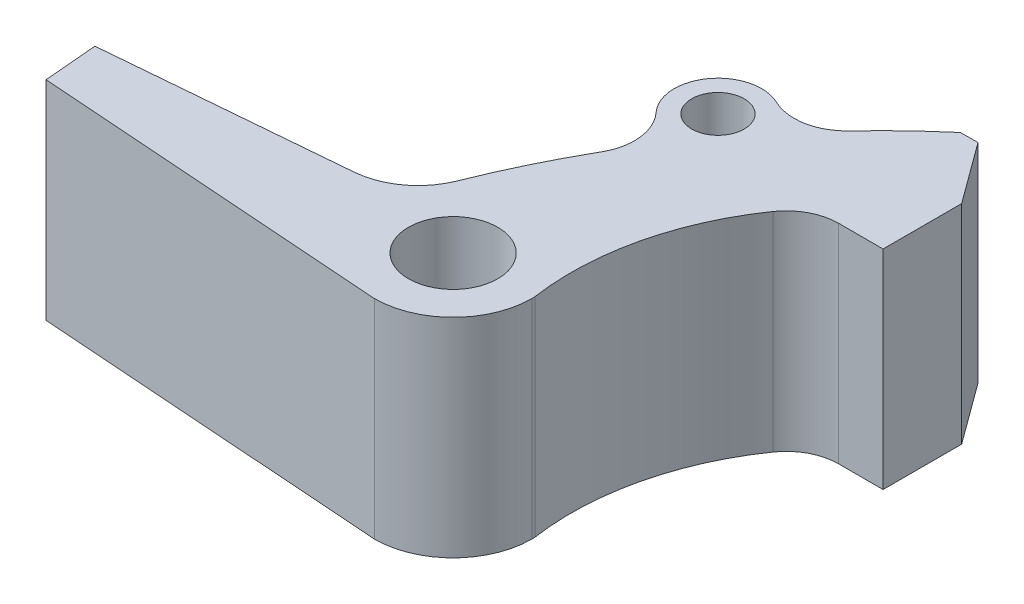
ISO-10303-21;
HEADER;
FILE_DESCRIPTION(('STEP AP214'),'2;1');
FILE_NAME('part.step','',(''),(''),'','','');
FILE_SCHEMA(('AUTOMOTIVE_DESIGN { 1 0 10303 214 1 1 1 1 }'));
ENDSEC;
DATA;
#1=APPLICATION_CONTEXT('core data for automotive mechanical design processes');
#2=APPLICATION_PROTOCOL_DEFINITION('international standard','automotive_design',2000,#1);
#3=PRODUCT_CONTEXT('',#1,'mechanical');
#4=PRODUCT('Part','Part','',(#3));
#5=PRODUCT_RELATED_PRODUCT_CATEGORY('part','',(#4));
#6=PRODUCT_DEFINITION_FORMATION('','',#4);
#7=PRODUCT_DEFINITION_CONTEXT('part definition',#1,'design');
#8=PRODUCT_DEFINITION('design','',#6,#7);
#9=PRODUCT_DEFINITION_SHAPE('','',#8);
#10=(LENGTH_UNIT() NAMED_UNIT(*) SI_UNIT(.MILLI.,.METRE.));
#11=(NAMED_UNIT(*) PLANE_ANGLE_UNIT() SI_UNIT($,.RADIAN.));
#12=(NAMED_UNIT(*) SI_UNIT($,.STERADIAN.) SOLID_ANGLE_UNIT());
#13=UNCERTAINTY_MEASURE_WITH_UNIT(LENGTH_MEASURE(1.E-05),#10,'distance_accuracy_value','');
#14=(GEOMETRIC_REPRESENTATION_CONTEXT(3) GLOBAL_UNCERTAINTY_ASSIGNED_CONTEXT((#13)) GLOBAL_UNIT_ASSIGNED_CONTEXT((#10,
#11,#12)) REPRESENTATION_CONTEXT('',''));
#15=CARTESIAN_POINT('',(0.,0.,0.));
#16=DIRECTION('',(0.,0.,1.));
#17=DIRECTION('',(1.,0.,0.));
#18=AXIS2_PLACEMENT_3D('',#15,#16,#17);
#19=CARTESIAN_POINT('',(3.09951762792645,11.9,-19.3887654268684));
#20=DIRECTION('',(0.,-1.,0.));
#21=DIRECTION('',(0.,0.,-1.));
#22=AXIS2_PLACEMENT_3D('',#19,#20,#21);
#23=CYLINDRICAL_SURFACE('',#22,3.);
#24=CARTESIAN_POINT('',(3.09951762792645,2.59,-19.3887654268684));
#25=DIRECTION('',(0.,1.,0.));
#26=DIRECTION('',(0.,0.,1.));
#27=AXIS2_PLACEMENT_3D('',#24,#25,#26);
#28=CIRCLE('',#27,3.);
#29=CARTESIAN_POINT('',(1.7947960396835,2.59,-16.6873395853594));
#30=VERTEX_POINT('',#29);
#31=CARTESIAN_POINT('',(5.27941384436174,2.59,-17.3276850098126));
#32=VERTEX_POINT('',#31);
#33=EDGE_CURVE('E63',#30,#32,#28,.T.);
#34=ORIENTED_EDGE('',*,*,#33,.T.);
#35=DIRECTION('',(0.,-1.,0.));
#36=VECTOR('',#35,1.);
#37=CARTESIAN_POINT('',(5.27941384436174,11.9,-17.3276850098126));
#38=LINE('',#37,#36);
#39=CARTESIAN_POINT('',(5.27941384436174,0.,-17.3276850098126));
#40=VERTEX_POINT('',#39);
#41=EDGE_CURVE('E296',#32,#40,#38,.T.);
#42=ORIENTED_EDGE('',*,*,#41,.T.);
#43=CARTESIAN_POINT('',(3.09951762792645,0.,-19.3887654268684));
#44=DIRECTION('',(0.,1.,0.));
#45=DIRECTION('',(0.,0.,1.));
#46=AXIS2_PLACEMENT_3D('',#43,#44,#45);
#47=CIRCLE('',#46,3.);
#48=CARTESIAN_POINT('',(1.79479603968349,0.,-16.6873395853594));
#49=VERTEX_POINT('',#48);
#50=EDGE_CURVE('E328',#49,#40,#47,.T.);
#51=ORIENTED_EDGE('',*,*,#50,.F.);
#52=DIRECTION('',(0.,-1.,0.));
#53=VECTOR('',#52,1.);
#54=CARTESIAN_POINT('',(1.79479603968349,11.9,-16.6873395853594));
#55=LINE('',#54,#53);
#56=EDGE_CURVE('E389',#30,#49,#55,.T.);
#57=ORIENTED_EDGE('',*,*,#56,.F.);
#58=EDGE_LOOP('',(#34,#42,#51,#57));
#59=FACE_BOUND('',#58,.T.);
#60=ADVANCED_FACE('F47',(#59),#23,.F.);
#61=CARTESIAN_POINT('',(-3.34631316143594,11.9,-10.7191133917387));
#62=DIRECTION('',(0.,-1.,0.));
#63=DIRECTION('',(0.,0.,-1.));
#64=AXIS2_PLACEMENT_3D('',#61,#62,#63);
#65=CYLINDRICAL_SURFACE('',#64,3.);
#66=DIRECTION('',(0.,-1.,0.));
#67=VECTOR('',#66,1.);
#68=CARTESIAN_POINT('',(-0.744733852199163,11.9,-9.22519736406142));
#69=LINE('',#68,#67);
#70=CARTESIAN_POINT('',(-0.744733852199163,2.59,-9.22519736406142));
#71=VERTEX_POINT('',#70);
#72=CARTESIAN_POINT('',(-0.744733852199163,0.,-9.22519736406142));
#73=VERTEX_POINT('',#72);
#74=EDGE_CURVE('E506',#71,#73,#69,.T.);
#75=ORIENTED_EDGE('',*,*,#74,.F.);
#76=CARTESIAN_POINT('',(-3.34631316143594,2.59,-10.7191133917387));
#77=DIRECTION('',(0.,1.,0.));
#78=DIRECTION('',(0.,0.,1.));
#79=AXIS2_PLACEMENT_3D('',#76,#77,#78);
#80=CIRCLE('',#79,3.);
#81=CARTESIAN_POINT('',(-1.13512704639032,2.59,-12.7465886603004));
#82=VERTEX_POINT('',#81);
#83=EDGE_CURVE('E315',#82,#71,#80,.F.);
#84=ORIENTED_EDGE('',*,*,#83,.F.);
#85=DIRECTION('',(0.,-1.,0.));
#86=VECTOR('',#85,1.);
#87=CARTESIAN_POINT('',(-1.13512704639032,11.9,-12.7465886603004));
#88=LINE('',#87,#86);
#89=CARTESIAN_POINT('',(-1.13512704639032,0.,-12.7465886603004));
#90=VERTEX_POINT('',#89);
#91=EDGE_CURVE('E238',#82,#90,#88,.T.);
#92=ORIENTED_EDGE('',*,*,#91,.T.);
#93=CARTESIAN_POINT('',(-3.34631316143594,0.,-10.7191133917387));
#94=DIRECTION('',(0.,1.,0.));
#95=DIRECTION('',(0.,0.,1.));
#96=AXIS2_PLACEMENT_3D('',#93,#94,#95);
#97=CIRCLE('',#96,3.);
#98=EDGE_CURVE('E401',#90,#73,#97,.F.);
#99=ORIENTED_EDGE('',*,*,#98,.T.);
#100=EDGE_LOOP('',(#75,#84,#92,#99));
#101=FACE_BOUND('',#100,.T.);
#102=ADVANCED_FACE('F548',(#101),#65,.F.);
#103=CARTESIAN_POINT('',(0.707528049481027,11.9,-14.4361513841019));
#104=DIRECTION('',(0.,-1.,0.));
#105=DIRECTION('',(0.,0.,-1.));
#106=AXIS2_PLACEMENT_3D('',#103,#104,#105);
#107=CYLINDRICAL_SURFACE('',#106,2.5);
#108=CARTESIAN_POINT('',(0.707528049481027,2.59,-14.4361513841019));
#109=DIRECTION('',(0.,1.,0.));
#110=DIRECTION('',(0.,0.,1.));
#111=AXIS2_PLACEMENT_3D('',#108,#109,#110);
#112=CIRCLE('',#111,2.5);
#113=EDGE_CURVE('E312',#30,#82,#112,.T.);
#114=ORIENTED_EDGE('',*,*,#113,.F.);
#115=ORIENTED_EDGE('',*,*,#56,.T.);
#116=CARTESIAN_POINT('',(0.707528049481027,0.,-14.4361513841019));
#117=DIRECTION('',(0.,1.,0.));
#118=DIRECTION('',(0.,0.,1.));
#119=AXIS2_PLACEMENT_3D('',#116,#117,#118);
#120=CIRCLE('',#119,2.5);
#121=EDGE_CURVE('E397',#49,#90,#120,.T.);
#122=ORIENTED_EDGE('',*,*,#121,.T.);
#123=ORIENTED_EDGE('',*,*,#91,.F.);
#124=EDGE_LOOP('',(#114,#115,#122,#123));
#125=FACE_BOUND('',#124,.T.);
#126=ADVANCED_FACE('F543',(#125),#107,.T.);
#127=CARTESIAN_POINT('',(-3.34631316143594,8.59,-10.7191133917387));
#128=DIRECTION('',(0.,1.,0.));
#129=DIRECTION('',(0.,0.,1.));
#130=AXIS2_PLACEMENT_3D('',#127,#128,#129);
#131=CIRCLE('',#130,3.);
#132=CARTESIAN_POINT('',(-1.13512704639032,8.59,-12.7465886603004));
#133=VERTEX_POINT('',#132);
#134=CARTESIAN_POINT('',(-0.744733852199163,8.59,-9.22519736406142));
#135=VERTEX_POINT('',#134);
#136=EDGE_CURVE('E71',#133,#135,#131,.F.);
#137=ORIENTED_EDGE('',*,*,#136,.T.);
#138=CARTESIAN_POINT('',(-0.744733852199163,11.9,-9.22519736406142));
#139=VERTEX_POINT('',#138);
#140=EDGE_CURVE('E243',#139,#135,#69,.T.);
#141=ORIENTED_EDGE('',*,*,#140,.F.);
#142=CARTESIAN_POINT('',(-3.34631316143594,11.9,-10.7191133917387));
#143=DIRECTION('',(0.,1.,0.));
#144=DIRECTION('',(0.,0.,1.));
#145=AXIS2_PLACEMENT_3D('',#142,#143,#144);
#146=CIRCLE('',#145,3.);
#147=CARTESIAN_POINT('',(-1.13512704639032,11.9,-12.7465886603004));
#148=VERTEX_POINT('',#147);
#149=EDGE_CURVE('E234',#148,#139,#146,.F.);
#150=ORIENTED_EDGE('',*,*,#149,.F.);
#151=EDGE_CURVE('E228',#148,#133,#88,.T.);
#152=ORIENTED_EDGE('',*,*,#151,.T.);
#153=EDGE_LOOP('',(#137,#141,#150,#152));
#154=FACE_BOUND('',#153,.T.);
#155=ADVANCED_FACE('F233',(#154),#65,.F.);
#156=CARTESIAN_POINT('',(0.707528049481027,11.9,-14.4361513841019));
#157=DIRECTION('',(0.,-1.,0.));
#158=DIRECTION('',(0.,0.,-1.));
#159=AXIS2_PLACEMENT_3D('',#156,#157,#158);
#160=CYLINDRICAL_SURFACE('',#159,1.50000000000008);
#161=CARTESIAN_POINT('',(0.707528049481027,0.,-14.4361513841019));
#162=DIRECTION('',(0.,1.,0.));
#163=DIRECTION('',(0.,0.,1.));
#164=AXIS2_PLACEMENT_3D('',#161,#162,#163);
#165=CIRCLE('',#164,1.50000000000008);
#166=CARTESIAN_POINT('',(0.707528049481027,0.,-12.9361513841018));
#167=VERTEX_POINT('',#166);
#168=EDGE_CURVE('E393',#167,#167,#165,.T.);
#169=ORIENTED_EDGE('',*,*,#168,.F.);
#170=EDGE_LOOP('',(#169));
#171=FACE_BOUND('',#170,.T.);
#172=CARTESIAN_POINT('',(0.707528049481027,2.59,-14.4361513841019));
#173=DIRECTION('',(0.,1.,0.));
#174=DIRECTION('',(0.,0.,1.));
#175=AXIS2_PLACEMENT_3D('',#172,#173,#174);
#176=CIRCLE('',#175,1.50000000000008);
#177=CARTESIAN_POINT('',(0.707528049481027,2.59,-12.9361513841018));
#178=VERTEX_POINT('',#177);
#179=EDGE_CURVE('E318',#178,#178,#176,.T.);
#180=ORIENTED_EDGE('',*,*,#179,.T.);
#181=EDGE_LOOP('',(#180));
#182=FACE_BOUND('',#181,.T.);
#183=ADVANCED_FACE('F611',(#171,#182),#160,.F.);
#184=CARTESIAN_POINT('',(5.27941384436174,11.9,-17.3276850098126));
#185=VERTEX_POINT('',#184);
#186=CARTESIAN_POINT('',(5.27941384436174,8.59,-17.3276850098126));
#187=VERTEX_POINT('',#186);
#188=EDGE_CURVE('E460',#185,#187,#38,.T.);
#189=ORIENTED_EDGE('',*,*,#188,.T.);
#190=CARTESIAN_POINT('',(3.09951762792645,8.59,-19.3887654268684));
#191=DIRECTION('',(0.,1.,0.));
#192=DIRECTION('',(0.,0.,1.));
#193=AXIS2_PLACEMENT_3D('',#190,#191,#192);
#194=CIRCLE('',#193,3.);
#195=CARTESIAN_POINT('',(1.79479603968349,8.59,-16.6873395853594));
#196=VERTEX_POINT('',#195);
#197=EDGE_CURVE('E237',#196,#187,#194,.T.);
#198=ORIENTED_EDGE('',*,*,#197,.F.);
#199=CARTESIAN_POINT('',(1.79479603968349,11.9,-16.6873395853594));
#200=VERTEX_POINT('',#199);
#201=EDGE_CURVE('E229',#200,#196,#55,.T.);
#202=ORIENTED_EDGE('',*,*,#201,.F.);
#203=CARTESIAN_POINT('',(3.09951762792645,11.9,-19.3887654268684));
#204=DIRECTION('',(0.,1.,0.));
#205=DIRECTION('',(0.,0.,1.));
#206=AXIS2_PLACEMENT_3D('',#203,#204,#205);
#207=CIRCLE('',#206,3.);
#208=EDGE_CURVE('E385',#200,#185,#207,.T.);
#209=ORIENTED_EDGE('',*,*,#208,.T.);
#210=EDGE_LOOP('',(#189,#198,#202,#209));
#211=FACE_BOUND('',#210,.T.);
#212=ADVANCED_FACE('F526',(#211),#23,.F.);
#213=ORIENTED_EDGE('',*,*,#201,.T.);
#214=CARTESIAN_POINT('',(0.707528049481027,8.59,-14.4361513841019));
#215=DIRECTION('',(0.,1.,0.));
#216=DIRECTION('',(0.,0.,1.));
#217=AXIS2_PLACEMENT_3D('',#214,#215,#216);
#218=CIRCLE('',#217,2.5);
#219=EDGE_CURVE('E215',#196,#133,#218,.T.);
#220=ORIENTED_EDGE('',*,*,#219,.T.);
#221=ORIENTED_EDGE('',*,*,#151,.F.);
#222=CARTESIAN_POINT('',(0.707528049481027,11.9,-14.4361513841019));
#223=DIRECTION('',(0.,1.,0.));
#224=DIRECTION('',(0.,0.,1.));
#225=AXIS2_PLACEMENT_3D('',#222,#223,#224);
#226=CIRCLE('',#225,2.5);
#227=EDGE_CURVE('E332',#200,#148,#226,.T.);
#228=ORIENTED_EDGE('',*,*,#227,.F.);
#229=EDGE_LOOP('',(#213,#220,#221,#228));
#230=FACE_BOUND('',#229,.T.);
#231=ADVANCED_FACE('F226',(#230),#107,.T.);
#232=CARTESIAN_POINT('',(36.4213234801882,11.9,12.1168268968537));
#233=DIRECTION('',(0.,-1.,0.));
#234=DIRECTION('',(0.,0.,-1.));
#235=AXIS2_PLACEMENT_3D('',#232,#233,#234);
#236=CYLINDRICAL_SURFACE('',#235,42.8578792894351);
#237=DIRECTION('',(0.,-1.,0.));
#238=VECTOR('',#237,1.);
#239=CARTESIAN_POINT('',(-2.43148884277572,11.9,-5.9734133388186));
#240=LINE('',#239,#238);
#241=CARTESIAN_POINT('',(-2.43148884277572,8.59,-5.9734133388186));
#242=VERTEX_POINT('',#241);
#243=CARTESIAN_POINT('',(-2.43148884277572,2.59,-5.9734133388186));
#244=VERTEX_POINT('',#243);
#245=EDGE_CURVE('E251',#242,#244,#240,.T.);
#246=ORIENTED_EDGE('',*,*,#245,.T.);
#247=CARTESIAN_POINT('',(36.4213234801882,2.59,12.1168268968537));
#248=DIRECTION('',(0.,1.,0.));
#249=DIRECTION('',(0.,0.,1.));
#250=AXIS2_PLACEMENT_3D('',#247,#248,#249);
#251=CIRCLE('',#250,42.8578792894351);
#252=EDGE_CURVE('E255',#244,#71,#251,.F.);
#253=ORIENTED_EDGE('',*,*,#252,.T.);
#254=ORIENTED_EDGE('',*,*,#74,.T.);
#255=CARTESIAN_POINT('',(36.4213234801882,0.,12.1168268968537));
#256=DIRECTION('',(0.,1.,0.));
#257=DIRECTION('',(0.,0.,1.));
#258=AXIS2_PLACEMENT_3D('',#255,#256,#257);
#259=CIRCLE('',#258,42.8578792894351);
#260=CARTESIAN_POINT('',(-3.41950310046817,0.,-3.67894325081112));
#261=VERTEX_POINT('',#260);
#262=EDGE_CURVE('E405',#73,#261,#259,.T.);
#263=ORIENTED_EDGE('',*,*,#262,.T.);
#264=DIRECTION('',(0.,-1.,0.));
#265=VECTOR('',#264,1.);
#266=CARTESIAN_POINT('',(-3.41950310046817,11.9,-3.67894325081112));
#267=LINE('',#266,#265);
#268=CARTESIAN_POINT('',(-3.41950310046817,11.9,-3.67894325081112));
#269=VERTEX_POINT('',#268);
#270=EDGE_CURVE('E503',#269,#261,#267,.T.);
#271=ORIENTED_EDGE('',*,*,#270,.F.);
#272=CARTESIAN_POINT('',(36.4213234801882,11.9,12.1168268968537));
#273=DIRECTION('',(0.,1.,0.));
#274=DIRECTION('',(0.,0.,1.));
#275=AXIS2_PLACEMENT_3D('',#272,#273,#274);
#276=CIRCLE('',#275,42.8578792894351);
#277=EDGE_CURVE('E337',#139,#269,#276,.T.);
#278=ORIENTED_EDGE('',*,*,#277,.F.);
#279=ORIENTED_EDGE('',*,*,#140,.T.);
#280=CARTESIAN_POINT('',(36.4213234801882,8.59,12.1168268968537));
#281=DIRECTION('',(0.,1.,0.));
#282=DIRECTION('',(0.,0.,1.));
#283=AXIS2_PLACEMENT_3D('',#280,#281,#282);
#284=CIRCLE('',#283,42.8578792894351);
#285=EDGE_CURVE('E218',#135,#242,#284,.T.);
#286=ORIENTED_EDGE('',*,*,#285,.T.);
#287=EDGE_LOOP('',(#246,#253,#254,#263,#271,#278,#279,#286));
#288=FACE_BOUND('',#287,.T.);
#289=ADVANCED_FACE('F516',(#288),#236,.T.);
#290=CARTESIAN_POINT('',(-7.13791635293888,11.9,-5.15318979866199));
#291=DIRECTION('',(0.,-1.,0.));
#292=DIRECTION('',(0.,0.,-1.));
#293=AXIS2_PLACEMENT_3D('',#290,#291,#292);
#294=CYLINDRICAL_SURFACE('',#293,4.);
#295=CARTESIAN_POINT('',(-7.13791635293888,0.,-5.15318979866199));
#296=DIRECTION('',(0.,1.,0.));
#297=DIRECTION('',(0.,0.,1.));
#298=AXIS2_PLACEMENT_3D('',#295,#296,#297);
#299=CIRCLE('',#298,4.);
#300=CARTESIAN_POINT('',(-6.79421691710457,0.,-1.1679833174609));
#301=VERTEX_POINT('',#300);
#302=EDGE_CURVE('E408',#261,#301,#299,.F.);
#303=ORIENTED_EDGE('',*,*,#302,.T.);
#304=DIRECTION('',(0.,-1.,0.));
#305=VECTOR('',#304,1.);
#306=CARTESIAN_POINT('',(-6.79421691710457,11.9,-1.1679833174609));
#307=LINE('',#306,#305);
#308=CARTESIAN_POINT('',(-6.79421691710457,11.9,-1.1679833174609));
#309=VERTEX_POINT('',#308);
#310=EDGE_CURVE('E500',#309,#301,#307,.T.);
#311=ORIENTED_EDGE('',*,*,#310,.F.);
#312=CARTESIAN_POINT('',(-7.13791635293888,11.9,-5.15318979866199));
#313=DIRECTION('',(0.,1.,0.));
#314=DIRECTION('',(0.,0.,1.));
#315=AXIS2_PLACEMENT_3D('',#312,#313,#314);
#316=CIRCLE('',#315,4.);
#317=EDGE_CURVE('E340',#269,#309,#316,.F.);
#318=ORIENTED_EDGE('',*,*,#317,.F.);
#319=ORIENTED_EDGE('',*,*,#270,.T.);
#320=EDGE_LOOP('',(#303,#311,#318,#319));
#321=FACE_BOUND('',#320,.T.);
#322=ADVANCED_FACE('F552',(#321),#294,.F.);
#323=CARTESIAN_POINT('',(-0.150149893323727,11.9,-1.74099304694186));
#324=DIRECTION('',(0.0859248589585767,0.,0.996301620300273));
#325=DIRECTION('',(0.996301620300273,0.,-0.0859248589585767));
#326=AXIS2_PLACEMENT_3D('',#323,#324,#325);
#327=PLANE('',#326);
#328=DIRECTION('',(-0.996301620300273,0.,0.0859248589585767));
#329=VECTOR('',#328,1.);
#330=CARTESIAN_POINT('',(-0.150149893323727,0.,-1.74099304694186));
#331=LINE('',#330,#329);
#332=CARTESIAN_POINT('',(-20.4349325322573,0.,0.0084441232299998));
#333=VERTEX_POINT('',#332);
#334=EDGE_CURVE('E411',#301,#333,#331,.T.);
#335=ORIENTED_EDGE('',*,*,#334,.T.);
#336=DIRECTION('',(0.,-1.,0.));
#337=VECTOR('',#336,1.);
#338=CARTESIAN_POINT('',(-20.4349325322573,11.9,0.0084441232299998));
#339=LINE('',#338,#337);
#340=CARTESIAN_POINT('',(-20.4349325322573,11.9,0.0084441232299998));
#341=VERTEX_POINT('',#340);
#342=EDGE_CURVE('E496',#341,#333,#339,.T.);
#343=ORIENTED_EDGE('',*,*,#342,.F.);
#344=DIRECTION('',(-0.996301620300273,0.,0.0859248589585767));
#345=VECTOR('',#344,1.);
#346=CARTESIAN_POINT('',(-0.150149893323727,11.9,-1.74099304694186));
#347=LINE('',#346,#345);
#348=EDGE_CURVE('E343',#309,#341,#347,.T.);
#349=ORIENTED_EDGE('',*,*,#348,.F.);
#350=ORIENTED_EDGE('',*,*,#310,.T.);
#351=EDGE_LOOP('',(#335,#343,#349,#350));
#352=FACE_BOUND('',#351,.T.);
#353=ADVANCED_FACE('F555',(#352),#327,.F.);
#354=CARTESIAN_POINT('',(-20.2847826389336,11.9,1.74943717017186));
#355=DIRECTION('',(0.996301620300273,0.,-0.0859248589585764));
#356=DIRECTION('',(-0.0859248589585764,0.,-0.996301620300273));
#357=AXIS2_PLACEMENT_3D('',#354,#355,#356);
#358=PLANE('',#357);
#359=DIRECTION('',(0.0859248589585764,0.,0.996301620300273));
#360=VECTOR('',#359,1.);
#361=CARTESIAN_POINT('',(-20.2847826389336,0.,1.74943717017186));
#362=LINE('',#361,#360);
#363=CARTESIAN_POINT('',(-20.171389855513,0.,3.06423029548542));
#364=VERTEX_POINT('',#363);
#365=EDGE_CURVE('E414',#333,#364,#362,.T.);
#366=ORIENTED_EDGE('',*,*,#365,.T.);
#367=DIRECTION('',(0.,-1.,0.));
#368=VECTOR('',#367,1.);
#369=CARTESIAN_POINT('',(-20.171389855513,11.9,3.06423029548542));
#370=LINE('',#369,#368);
#371=CARTESIAN_POINT('',(-20.171389855513,11.9,3.06423029548542));
#372=VERTEX_POINT('',#371);
#373=EDGE_CURVE('E492',#372,#364,#370,.T.);
#374=ORIENTED_EDGE('',*,*,#373,.F.);
#375=DIRECTION('',(0.0859248589585764,0.,0.996301620300273));
#376=VECTOR('',#375,1.);
#377=CARTESIAN_POINT('',(-20.2847826389336,11.9,1.74943717017186));
#378=LINE('',#377,#376);
#379=EDGE_CURVE('E346',#341,#372,#378,.T.);
#380=ORIENTED_EDGE('',*,*,#379,.F.);
#381=ORIENTED_EDGE('',*,*,#342,.T.);
#382=EDGE_LOOP('',(#366,#374,#380,#381));
#383=FACE_BOUND('',#382,.T.);
#384=ADVANCED_FACE('F562',(#383),#358,.F.);
#385=CARTESIAN_POINT('',(-0.320632476468766,11.9,4.4837544082497));
#386=DIRECTION('',(0.0713276812885889,0.,-0.997452937176483));
#387=DIRECTION('',(-0.997452937176483,0.,-0.0713276812885889));
#388=AXIS2_PLACEMENT_3D('',#385,#386,#387);
#389=PLANE('',#388);
#390=DIRECTION('',(0.997452937176483,0.,0.0713276812885889));
#391=VECTOR('',#390,1.);
#392=CARTESIAN_POINT('',(-0.320632476468766,0.,4.4837544082497));
#393=LINE('',#392,#391);
#394=CARTESIAN_POINT('',(0.0246307969273221,0.,4.5084441232303));
#395=VERTEX_POINT('',#394);
#396=EDGE_CURVE('E417',#364,#395,#393,.T.);
#397=ORIENTED_EDGE('',*,*,#396,.T.);
#398=DIRECTION('',(0.,-1.,0.));
#399=VECTOR('',#398,1.);
#400=CARTESIAN_POINT('',(0.0246307969273221,11.9,4.5084441232303));
#401=LINE('',#400,#399);
#402=CARTESIAN_POINT('',(0.0246307969273221,11.9,4.5084441232303));
#403=VERTEX_POINT('',#402);
#404=EDGE_CURVE('E488',#403,#395,#401,.T.);
#405=ORIENTED_EDGE('',*,*,#404,.F.);
#406=DIRECTION('',(0.997452937176483,0.,0.0713276812885889));
#407=VECTOR('',#406,1.);
#408=CARTESIAN_POINT('',(-0.320632476468766,11.9,4.4837544082497));
#409=LINE('',#408,#407);
#410=EDGE_CURVE('E349',#372,#403,#409,.T.);
#411=ORIENTED_EDGE('',*,*,#410,.F.);
#412=ORIENTED_EDGE('',*,*,#373,.T.);
#413=EDGE_LOOP('',(#397,#405,#411,#412));
#414=FACE_BOUND('',#413,.T.);
#415=ADVANCED_FACE('F565',(#414),#389,.F.);
#416=CARTESIAN_POINT('',(0.0246307969273222,11.9,0.00844412323029991));
#417=DIRECTION('',(0.,-1.,0.));
#418=DIRECTION('',(0.,0.,-1.));
#419=AXIS2_PLACEMENT_3D('',#416,#417,#418);
#420=CYLINDRICAL_SURFACE('',#419,4.5);
#421=CARTESIAN_POINT('',(0.0246307969273222,0.,0.00844412323029991));
#422=DIRECTION('',(0.,1.,0.));
#423=DIRECTION('',(0.,0.,1.));
#424=AXIS2_PLACEMENT_3D('',#421,#422,#423);
#425=CIRCLE('',#424,4.5);
#426=CARTESIAN_POINT('',(4.52463079692732,0.,0.00844412323029644));
#427=VERTEX_POINT('',#426);
#428=EDGE_CURVE('E420',#395,#427,#425,.T.);
#429=ORIENTED_EDGE('',*,*,#428,.T.);
#430=DIRECTION('',(0.,-1.,0.));
#431=VECTOR('',#430,1.);
#432=CARTESIAN_POINT('',(4.52463079692732,11.9,0.00844412323029644));
#433=LINE('',#432,#431);
#434=CARTESIAN_POINT('',(4.52463079692732,11.9,0.00844412323029644));
#435=VERTEX_POINT('',#434);
#436=EDGE_CURVE('E485',#435,#427,#433,.T.);
#437=ORIENTED_EDGE('',*,*,#436,.F.);
#438=CARTESIAN_POINT('',(0.0246307969273222,11.9,0.00844412323029991));
#439=DIRECTION('',(0.,1.,0.));
#440=DIRECTION('',(0.,0.,1.));
#441=AXIS2_PLACEMENT_3D('',#438,#439,#440);
#442=CIRCLE('',#441,4.5);
#443=EDGE_CURVE('E352',#403,#435,#442,.T.);
#444=ORIENTED_EDGE('',*,*,#443,.F.);
#445=ORIENTED_EDGE('',*,*,#404,.T.);
#446=EDGE_LOOP('',(#429,#437,#444,#445));
#447=FACE_BOUND('',#446,.T.);
#448=ADVANCED_FACE('F570',(#447),#420,.T.);
#449=CARTESIAN_POINT('',(33.240723777543,11.9,-0.607242338692442));
#450=DIRECTION('',(0.,-1.,0.));
#451=DIRECTION('',(0.,0.,-1.));
#452=AXIS2_PLACEMENT_3D('',#449,#450,#451);
#453=CYLINDRICAL_SURFACE('',#452,28.7226925250883);
#454=CARTESIAN_POINT('',(33.240723777543,0.,-0.607242338692442));
#455=DIRECTION('',(0.,1.,0.));
#456=DIRECTION('',(0.,0.,1.));
#457=AXIS2_PLACEMENT_3D('',#454,#455,#456);
#458=CIRCLE('',#457,28.7226925250883);
#459=CARTESIAN_POINT('',(4.52153967998551,0.,-0.158320673631232));
#460=VERTEX_POINT('',#459);
#461=EDGE_CURVE('E424',#460,#427,#458,.T.);
#462=ORIENTED_EDGE('',*,*,#461,.F.);
#463=DIRECTION('',(0.,-1.,0.));
#464=VECTOR('',#463,1.);
#465=CARTESIAN_POINT('',(4.52153967998551,11.9,-0.158320673631232));
#466=LINE('',#465,#464);
#467=CARTESIAN_POINT('',(4.52153967998551,11.9,-0.158320673631232));
#468=VERTEX_POINT('',#467);
#469=EDGE_CURVE('E482',#468,#460,#466,.T.);
#470=ORIENTED_EDGE('',*,*,#469,.F.);
#471=CARTESIAN_POINT('',(33.240723777543,11.9,-0.607242338692442));
#472=DIRECTION('',(0.,1.,0.));
#473=DIRECTION('',(0.,0.,1.));
#474=AXIS2_PLACEMENT_3D('',#471,#472,#473);
#475=CIRCLE('',#474,28.7226925250883);
#476=EDGE_CURVE('E355',#468,#435,#475,.T.);
#477=ORIENTED_EDGE('',*,*,#476,.T.);
#478=ORIENTED_EDGE('',*,*,#436,.T.);
#479=EDGE_LOOP('',(#462,#470,#477,#478));
#480=FACE_BOUND('',#479,.T.);
#481=ADVANCED_FACE('F577',(#480),#453,.F.);
#482=CARTESIAN_POINT('',(19.762579399235,11.9,-2.40159081150873));
#483=DIRECTION('',(0.,-1.,0.));
#484=DIRECTION('',(0.,0.,-1.));
#485=AXIS2_PLACEMENT_3D('',#482,#483,#484);
#486=CYLINDRICAL_SURFACE('',#485,15.4052443224777);
#487=CARTESIAN_POINT('',(19.762579399235,0.,-2.40159081150873));
#488=DIRECTION('',(0.,1.,0.));
#489=DIRECTION('',(0.,0.,1.));
#490=AXIS2_PLACEMENT_3D('',#487,#488,#489);
#491=CIRCLE('',#490,15.4052443224777);
#492=CARTESIAN_POINT('',(7.10310386614454,0.,-11.1799295986778));
#493=VERTEX_POINT('',#492);
#494=EDGE_CURVE('E428',#460,#493,#491,.F.);
#495=ORIENTED_EDGE('',*,*,#494,.T.);
#496=DIRECTION('',(0.,-1.,0.));
#497=VECTOR('',#496,1.);
#498=CARTESIAN_POINT('',(7.10310386614454,11.9,-11.1799295986778));
#499=LINE('',#498,#497);
#500=CARTESIAN_POINT('',(7.10310386614454,11.9,-11.1799295986778));
#501=VERTEX_POINT('',#500);
#502=EDGE_CURVE('E479',#501,#493,#499,.T.);
#503=ORIENTED_EDGE('',*,*,#502,.F.);
#504=CARTESIAN_POINT('',(19.762579399235,11.9,-2.40159081150873));
#505=DIRECTION('',(0.,1.,0.));
#506=DIRECTION('',(0.,0.,1.));
#507=AXIS2_PLACEMENT_3D('',#504,#505,#506);
#508=CIRCLE('',#507,15.4052443224777);
#509=EDGE_CURVE('E359',#468,#501,#508,.F.);
#510=ORIENTED_EDGE('',*,*,#509,.F.);
#511=ORIENTED_EDGE('',*,*,#469,.T.);
#512=EDGE_LOOP('',(#495,#503,#510,#511));
#513=FACE_BOUND('',#512,.T.);
#514=ADVANCED_FACE('F580',(#513),#486,.F.);
#515=CARTESIAN_POINT('',(9.56839593190276,11.9,-9.4704457495264));
#516=DIRECTION('',(0.,-1.,0.));
#517=DIRECTION('',(0.,0.,-1.));
#518=AXIS2_PLACEMENT_3D('',#515,#516,#517);
#519=CYLINDRICAL_SURFACE('',#518,3.);
#520=CARTESIAN_POINT('',(9.56839593190276,0.,-9.4704457495264));
#521=DIRECTION('',(0.,1.,0.));
#522=DIRECTION('',(0.,0.,1.));
#523=AXIS2_PLACEMENT_3D('',#520,#521,#522);
#524=CIRCLE('',#523,3.);
#525=CARTESIAN_POINT('',(9.56839593190276,0.,-12.4704457495264));
#526=VERTEX_POINT('',#525);
#527=EDGE_CURVE('E432',#526,#493,#524,.T.);
#528=ORIENTED_EDGE('',*,*,#527,.F.);
#529=DIRECTION('',(0.,-1.,0.));
#530=VECTOR('',#529,1.);
#531=CARTESIAN_POINT('',(9.56839593190276,11.9,-12.4704457495264));
#532=LINE('',#531,#530);
#533=CARTESIAN_POINT('',(9.56839593190276,11.9,-12.4704457495264));
#534=VERTEX_POINT('',#533);
#535=EDGE_CURVE('E476',#534,#526,#532,.T.);
#536=ORIENTED_EDGE('',*,*,#535,.F.);
#537=CARTESIAN_POINT('',(9.56839593190276,11.9,-9.4704457495264));
#538=DIRECTION('',(0.,1.,0.));
#539=DIRECTION('',(0.,0.,1.));
#540=AXIS2_PLACEMENT_3D('',#537,#538,#539);
#541=CIRCLE('',#540,3.);
#542=EDGE_CURVE('E362',#534,#501,#541,.T.);
#543=ORIENTED_EDGE('',*,*,#542,.T.);
#544=ORIENTED_EDGE('',*,*,#502,.T.);
#545=EDGE_LOOP('',(#528,#536,#543,#544));
#546=FACE_BOUND('',#545,.T.);
#547=ADVANCED_FACE('F583',(#546),#519,.F.);
#548=CARTESIAN_POINT('',(0.,11.9,-12.4704457495264));
#549=DIRECTION('',(0.,0.,1.));
#550=DIRECTION('',(1.,0.,0.));
#551=AXIS2_PLACEMENT_3D('',#548,#549,#550);
#552=PLANE('',#551);
#553=DIRECTION('',(-1.,0.,0.));
#554=VECTOR('',#553,1.);
#555=CARTESIAN_POINT('',(0.,0.,-12.4704457495264));
#556=LINE('',#555,#554);
#557=CARTESIAN_POINT('',(12.1032606853366,0.,-12.4704457495264));
#558=VERTEX_POINT('',#557);
#559=EDGE_CURVE('E436',#558,#526,#556,.T.);
#560=ORIENTED_EDGE('',*,*,#559,.F.);
#561=DIRECTION('',(0.,-1.,0.));
#562=VECTOR('',#561,1.);
#563=CARTESIAN_POINT('',(12.1032606853366,11.9,-12.4704457495264));
#564=LINE('',#563,#562);
#565=CARTESIAN_POINT('',(12.1032606853366,11.9,-12.4704457495264));
#566=VERTEX_POINT('',#565);
#567=EDGE_CURVE('E473',#566,#558,#564,.T.);
#568=ORIENTED_EDGE('',*,*,#567,.F.);
#569=DIRECTION('',(-1.,0.,0.));
#570=VECTOR('',#569,1.);
#571=CARTESIAN_POINT('',(0.,11.9,-12.4704457495264));
#572=LINE('',#571,#570);
#573=EDGE_CURVE('E366',#566,#534,#572,.T.);
#574=ORIENTED_EDGE('',*,*,#573,.T.);
#575=ORIENTED_EDGE('',*,*,#535,.T.);
#576=EDGE_LOOP('',(#560,#568,#574,#575));
#577=FACE_BOUND('',#576,.T.);
#578=ADVANCED_FACE('F587',(#577),#552,.T.);
#579=CARTESIAN_POINT('',(12.1032606853366,11.9,0.));
#580=DIRECTION('',(1.,0.,0.));
#581=DIRECTION('',(0.,0.,-1.));
#582=AXIS2_PLACEMENT_3D('',#579,#580,#581);
#583=PLANE('',#582);
#584=DIRECTION('',(0.,0.,1.));
#585=VECTOR('',#584,1.);
#586=CARTESIAN_POINT('',(12.1032606853366,0.,0.));
#587=LINE('',#586,#585);
#588=CARTESIAN_POINT('',(12.1032606853366,0.,-16.9576957382778));
#589=VERTEX_POINT('',#588);
#590=EDGE_CURVE('E440',#589,#558,#587,.T.);
#591=ORIENTED_EDGE('',*,*,#590,.F.);
#592=DIRECTION('',(0.,-1.,0.));
#593=VECTOR('',#592,1.);
#594=CARTESIAN_POINT('',(12.1032606853366,11.9,-16.9576957382778));
#595=LINE('',#594,#593);
#596=CARTESIAN_POINT('',(12.1032606853366,11.9,-16.9576957382778));
#597=VERTEX_POINT('',#596);
#598=EDGE_CURVE('E470',#597,#589,#595,.T.);
#599=ORIENTED_EDGE('',*,*,#598,.F.);
#600=DIRECTION('',(0.,0.,1.));
#601=VECTOR('',#600,1.);
#602=CARTESIAN_POINT('',(12.1032606853366,11.9,0.));
#603=LINE('',#602,#601);
#604=EDGE_CURVE('E370',#597,#566,#603,.T.);
#605=ORIENTED_EDGE('',*,*,#604,.T.);
#606=ORIENTED_EDGE('',*,*,#567,.T.);
#607=EDGE_LOOP('',(#591,#599,#605,#606));
#608=FACE_BOUND('',#607,.T.);
#609=ADVANCED_FACE('F590',(#608),#583,.T.);
#610=CARTESIAN_POINT('',(15.9619462400268,11.9,-11.6880112814427));
#611=DIRECTION('',(0.806824598604017,0.,-0.590791051969701));
#612=DIRECTION('',(-0.590791051969701,0.,-0.806824598604017));
#613=AXIS2_PLACEMENT_3D('',#610,#611,#612);
#614=PLANE('',#613);
#615=DIRECTION('',(0.590791051969701,0.,0.806824598604017));
#616=VECTOR('',#615,1.);
#617=CARTESIAN_POINT('',(15.9619462400268,0.,-11.6880112814427));
#618=LINE('',#617,#616);
#619=CARTESIAN_POINT('',(9.54871951682514,0.,-20.4463515769708));
#620=VERTEX_POINT('',#619);
#621=EDGE_CURVE('E444',#620,#589,#618,.T.);
#622=ORIENTED_EDGE('',*,*,#621,.F.);
#623=DIRECTION('',(0.,-1.,0.));
#624=VECTOR('',#623,1.);
#625=CARTESIAN_POINT('',(9.54871951682514,11.9,-20.4463515769708));
#626=LINE('',#625,#624);
#627=CARTESIAN_POINT('',(9.54871951682514,11.9,-20.4463515769708));
#628=VERTEX_POINT('',#627);
#629=EDGE_CURVE('E467',#628,#620,#626,.T.);
#630=ORIENTED_EDGE('',*,*,#629,.F.);
#631=DIRECTION('',(0.590791051969701,0.,0.806824598604017));
#632=VECTOR('',#631,1.);
#633=CARTESIAN_POINT('',(15.9619462400268,11.9,-11.6880112814427));
#634=LINE('',#633,#632);
#635=EDGE_CURVE('E374',#628,#597,#634,.T.);
#636=ORIENTED_EDGE('',*,*,#635,.T.);
#637=ORIENTED_EDGE('',*,*,#598,.T.);
#638=EDGE_LOOP('',(#622,#630,#636,#637));
#639=FACE_BOUND('',#638,.T.);
#640=ADVANCED_FACE('F592',(#639),#614,.T.);
#641=CARTESIAN_POINT('',(-0.139215512138598,11.9,-20.3801739850813));
#642=DIRECTION('',(-0.00683076917527596,0.,-0.999976670024093));
#643=DIRECTION('',(-0.999976670024093,0.,0.00683076917527596));
#644=AXIS2_PLACEMENT_3D('',#641,#642,#643);
#645=PLANE('',#644);
#646=DIRECTION('',(0.999976670024093,0.,-0.00683076917527596));
#647=VECTOR('',#646,1.);
#648=CARTESIAN_POINT('',(-0.139215512138598,0.,-20.3801739850813));
#649=LINE('',#648,#647);
#650=CARTESIAN_POINT('',(8.54871951682514,0.,-20.4395206484302));
#651=VERTEX_POINT('',#650);
#652=EDGE_CURVE('E448',#651,#620,#649,.T.);
#653=ORIENTED_EDGE('',*,*,#652,.F.);
#654=DIRECTION('',(0.,-1.,0.));
#655=VECTOR('',#654,1.);
#656=CARTESIAN_POINT('',(8.54871951682514,11.9,-20.4395206484302));
#657=LINE('',#656,#655);
#658=CARTESIAN_POINT('',(8.54871951682514,11.9,-20.4395206484302));
#659=VERTEX_POINT('',#658);
#660=EDGE_CURVE('E464',#659,#651,#657,.T.);
#661=ORIENTED_EDGE('',*,*,#660,.F.);
#662=DIRECTION('',(0.999976670024093,0.,-0.00683076917527596));
#663=VECTOR('',#662,1.);
#664=CARTESIAN_POINT('',(-0.139215512138598,11.9,-20.3801739850813));
#665=LINE('',#664,#663);
#666=EDGE_CURVE('E378',#659,#628,#665,.T.);
#667=ORIENTED_EDGE('',*,*,#666,.T.);
#668=ORIENTED_EDGE('',*,*,#629,.T.);
#669=EDGE_LOOP('',(#653,#661,#667,#668));
#670=FACE_BOUND('',#669,.T.);
#671=ADVANCED_FACE('F532',(#670),#645,.T.);
#672=CARTESIAN_POINT('',(36.4213234801882,11.9,12.1168268968537));
#673=DIRECTION('',(0.,-1.,0.));
#674=DIRECTION('',(0.,0.,-1.));
#675=AXIS2_PLACEMENT_3D('',#672,#673,#674);
#676=CYLINDRICAL_SURFACE('',#675,42.8578792894351);
#677=ORIENTED_EDGE('',*,*,#41,.F.);
#678=CARTESIAN_POINT('',(36.4213234801882,2.59,12.1168268968537));
#679=DIRECTION('',(0.,1.,0.));
#680=DIRECTION('',(0.,0.,1.));
#681=AXIS2_PLACEMENT_3D('',#678,#679,#680);
#682=CIRCLE('',#681,42.8578792894351);
#683=CARTESIAN_POINT('',(7.90760848557964,2.59,-19.8795146814272));
#684=VERTEX_POINT('',#683);
#685=EDGE_CURVE('E274',#32,#684,#682,.F.);
#686=ORIENTED_EDGE('',*,*,#685,.T.);
#687=DIRECTION('',(0.,-1.,0.));
#688=VECTOR('',#687,1.);
#689=CARTESIAN_POINT('',(7.90760848557965,11.9,-19.8795146814272));
#690=LINE('',#689,#688);
#691=CARTESIAN_POINT('',(7.90760848557964,8.59,-19.8795146814272));
#692=VERTEX_POINT('',#691);
#693=EDGE_CURVE('E270',#684,#692,#690,.F.);
#694=ORIENTED_EDGE('',*,*,#693,.T.);
#695=CARTESIAN_POINT('',(36.4213234801882,8.59,12.1168268968537));
#696=DIRECTION('',(0.,1.,0.));
#697=DIRECTION('',(0.,0.,1.));
#698=AXIS2_PLACEMENT_3D('',#695,#696,#697);
#699=CIRCLE('',#698,42.8578792894351);
#700=EDGE_CURVE('E266',#692,#187,#699,.T.);
#701=ORIENTED_EDGE('',*,*,#700,.T.);
#702=ORIENTED_EDGE('',*,*,#188,.F.);
#703=CARTESIAN_POINT('',(36.4213234801882,11.9,12.1168268968537));
#704=DIRECTION('',(0.,1.,0.));
#705=DIRECTION('',(0.,0.,1.));
#706=AXIS2_PLACEMENT_3D('',#703,#704,#705);
#707=CIRCLE('',#706,42.8578792894351);
#708=EDGE_CURVE('E382',#659,#185,#707,.T.);
#709=ORIENTED_EDGE('',*,*,#708,.F.);
#710=ORIENTED_EDGE('',*,*,#660,.T.);
#711=CARTESIAN_POINT('',(36.4213234801882,0.,12.1168268968537));
#712=DIRECTION('',(0.,1.,0.));
#713=DIRECTION('',(0.,0.,1.));
#714=AXIS2_PLACEMENT_3D('',#711,#712,#713);
#715=CIRCLE('',#714,42.8578792894351);
#716=EDGE_CURVE('E452',#651,#40,#715,.T.);
#717=ORIENTED_EDGE('',*,*,#716,.T.);
#718=EDGE_LOOP('',(#677,#686,#694,#701,#702,#709,#710,#717));
#719=FACE_BOUND('',#718,.T.);
#720=ADVANCED_FACE('F293',(#719),#676,.T.);
#721=CARTESIAN_POINT('',(0.707528049481027,8.59,-14.4361513841019));
#722=DIRECTION('',(0.,1.,0.));
#723=DIRECTION('',(0.,0.,1.));
#724=AXIS2_PLACEMENT_3D('',#721,#722,#723);
#725=CIRCLE('',#724,1.50000000000008);
#726=CARTESIAN_POINT('',(0.707528049481027,8.59,-12.9361513841018));
#727=VERTEX_POINT('',#726);
#728=EDGE_CURVE('E221',#727,#727,#725,.T.);
#729=ORIENTED_EDGE('',*,*,#728,.F.);
#730=EDGE_LOOP('',(#729));
#731=FACE_BOUND('',#730,.T.);
#732=CARTESIAN_POINT('',(0.707528049481027,11.9,-14.4361513841019));
#733=DIRECTION('',(0.,1.,0.));
#734=DIRECTION('',(0.,0.,1.));
#735=AXIS2_PLACEMENT_3D('',#732,#733,#734);
#736=CIRCLE('',#735,1.50000000000008);
#737=CARTESIAN_POINT('',(0.707528049481027,11.9,-12.9361513841018));
#738=VERTEX_POINT('',#737);
#739=EDGE_CURVE('E327',#738,#738,#736,.T.);
#740=ORIENTED_EDGE('',*,*,#739,.T.);
#741=EDGE_LOOP('',(#740));
#742=FACE_BOUND('',#741,.T.);
#743=ADVANCED_FACE('F621',(#731,#742),#160,.F.);
#744=CARTESIAN_POINT('',(0.0246307969273222,11.9,0.00844412323029991));
#745=DIRECTION('',(0.,-1.,0.));
#746=DIRECTION('',(0.,0.,-1.));
#747=AXIS2_PLACEMENT_3D('',#744,#745,#746);
#748=CYLINDRICAL_SURFACE('',#747,2.55000000000004);
#749=CARTESIAN_POINT('',(0.0246307969273222,11.9,0.00844412323029991));
#750=DIRECTION('',(0.,1.,0.));
#751=DIRECTION('',(0.,0.,1.));
#752=AXIS2_PLACEMENT_3D('',#749,#750,#751);
#753=CIRCLE('',#752,2.55000000000004);
#754=CARTESIAN_POINT('',(0.0246307969273222,11.9,2.55844412323034));
#755=VERTEX_POINT('',#754);
#756=EDGE_CURVE('E323',#755,#755,#753,.T.);
#757=ORIENTED_EDGE('',*,*,#756,.T.);
#758=EDGE_LOOP('',(#757));
#759=FACE_BOUND('',#758,.T.);
#760=CARTESIAN_POINT('',(0.0246307969273222,0.,0.00844412323029991));
#761=DIRECTION('',(0.,1.,0.));
#762=DIRECTION('',(0.,0.,1.));
#763=AXIS2_PLACEMENT_3D('',#760,#761,#762);
#764=CIRCLE('',#763,2.55000000000004);
#765=CARTESIAN_POINT('',(0.0246307969273222,0.,2.55844412323034));
#766=VERTEX_POINT('',#765);
#767=EDGE_CURVE('E322',#766,#766,#764,.T.);
#768=ORIENTED_EDGE('',*,*,#767,.F.);
#769=EDGE_LOOP('',(#768));
#770=FACE_BOUND('',#769,.T.);
#771=ADVANCED_FACE('F628',(#759,#770),#748,.F.);
#772=CARTESIAN_POINT('',(0.,11.9,0.));
#773=DIRECTION('',(0.,1.,0.));
#774=DIRECTION('',(0.,0.,1.));
#775=AXIS2_PLACEMENT_3D('',#772,#773,#774);
#776=PLANE('',#775);
#777=ORIENTED_EDGE('',*,*,#756,.F.);
#778=EDGE_LOOP('',(#777));
#779=FACE_BOUND('',#778,.T.);
#780=ORIENTED_EDGE('',*,*,#739,.F.);
#781=EDGE_LOOP('',(#780));
#782=FACE_BOUND('',#781,.T.);
#783=ORIENTED_EDGE('',*,*,#227,.T.);
#784=ORIENTED_EDGE('',*,*,#149,.T.);
#785=ORIENTED_EDGE('',*,*,#277,.T.);
#786=ORIENTED_EDGE('',*,*,#317,.T.);
#787=ORIENTED_EDGE('',*,*,#348,.T.);
#788=ORIENTED_EDGE('',*,*,#379,.T.);
#789=ORIENTED_EDGE('',*,*,#410,.T.);
#790=ORIENTED_EDGE('',*,*,#443,.T.);
#791=ORIENTED_EDGE('',*,*,#476,.F.);
#792=ORIENTED_EDGE('',*,*,#509,.T.);
#793=ORIENTED_EDGE('',*,*,#542,.F.);
#794=ORIENTED_EDGE('',*,*,#573,.F.);
#795=ORIENTED_EDGE('',*,*,#604,.F.);
#796=ORIENTED_EDGE('',*,*,#635,.F.);
#797=ORIENTED_EDGE('',*,*,#666,.F.);
#798=ORIENTED_EDGE('',*,*,#708,.T.);
#799=ORIENTED_EDGE('',*,*,#208,.F.);
#800=EDGE_LOOP('',(#783,#784,#785,#786,#787,#788,#789,#790,#791,#792,#793,#794,#795,#796,#797,
#798,#799));
#801=FACE_BOUND('',#800,.T.);
#802=ADVANCED_FACE('F519',(#779,#782,#801),#776,.T.);
#803=CARTESIAN_POINT('',(0.,0.,0.));
#804=DIRECTION('',(0.,1.,0.));
#805=DIRECTION('',(0.,0.,1.));
#806=AXIS2_PLACEMENT_3D('',#803,#804,#805);
#807=PLANE('',#806);
#808=ORIENTED_EDGE('',*,*,#767,.T.);
#809=EDGE_LOOP('',(#808));
#810=FACE_BOUND('',#809,.T.);
#811=ORIENTED_EDGE('',*,*,#168,.T.);
#812=EDGE_LOOP('',(#811));
#813=FACE_BOUND('',#812,.T.);
#814=ORIENTED_EDGE('',*,*,#121,.F.);
#815=ORIENTED_EDGE('',*,*,#50,.T.);
#816=ORIENTED_EDGE('',*,*,#716,.F.);
#817=ORIENTED_EDGE('',*,*,#652,.T.);
#818=ORIENTED_EDGE('',*,*,#621,.T.);
#819=ORIENTED_EDGE('',*,*,#590,.T.);
#820=ORIENTED_EDGE('',*,*,#559,.T.);
#821=ORIENTED_EDGE('',*,*,#527,.T.);
#822=ORIENTED_EDGE('',*,*,#494,.F.);
#823=ORIENTED_EDGE('',*,*,#461,.T.);
#824=ORIENTED_EDGE('',*,*,#428,.F.);
#825=ORIENTED_EDGE('',*,*,#396,.F.);
#826=ORIENTED_EDGE('',*,*,#365,.F.);
#827=ORIENTED_EDGE('',*,*,#334,.F.);
#828=ORIENTED_EDGE('',*,*,#302,.F.);
#829=ORIENTED_EDGE('',*,*,#262,.F.);
#830=ORIENTED_EDGE('',*,*,#98,.F.);
#831=EDGE_LOOP('',(#814,#815,#816,#817,#818,#819,#820,#821,#822,#823,#824,#825,#826,#827,#828,
#829,#830));
#832=FACE_BOUND('',#831,.T.);
#833=ADVANCED_FACE('F536',(#810,#813,#832),#807,.F.);
#834=CARTESIAN_POINT('',(0.707528049481027,2.59,-14.4361513841019));
#835=DIRECTION('',(0.,1.,0.));
#836=DIRECTION('',(0.,0.,1.));
#837=AXIS2_PLACEMENT_3D('',#834,#835,#836);
#838=CYLINDRICAL_SURFACE('',#837,4.);
#839=CARTESIAN_POINT('',(0.707528049481027,2.59,-14.4361513841019));
#840=DIRECTION('',(0.,1.,0.));
#841=DIRECTION('',(0.,0.,1.));
#842=AXIS2_PLACEMENT_3D('',#839,#840,#841);
#843=CIRCLE('',#842,4.);
#844=CARTESIAN_POINT('',(2.40080906094731,2.59,-10.812230935719));
#845=VERTEX_POINT('',#844);
#846=CARTESIAN_POINT('',(4.66557555769186,2.59,-13.8583452550707));
#847=VERTEX_POINT('',#846);
#848=EDGE_CURVE('E231',#845,#847,#843,.T.);
#849=ORIENTED_EDGE('',*,*,#848,.F.);
#850=DIRECTION('',(0.,1.,0.));
#851=VECTOR('',#850,1.);
#852=CARTESIAN_POINT('',(2.40080906094731,2.59,-10.812230935719));
#853=LINE('',#852,#851);
#854=CARTESIAN_POINT('',(2.40080906094731,8.59,-10.812230935719));
#855=VERTEX_POINT('',#854);
#856=EDGE_CURVE('E263',#845,#855,#853,.T.);
#857=ORIENTED_EDGE('',*,*,#856,.T.);
#858=CARTESIAN_POINT('',(0.707528049481027,8.59,-14.4361513841019));
#859=DIRECTION('',(0.,1.,0.));
#860=DIRECTION('',(0.,0.,1.));
#861=AXIS2_PLACEMENT_3D('',#858,#859,#860);
#862=CIRCLE('',#861,4.);
#863=CARTESIAN_POINT('',(4.66557555769186,8.59,-13.8583452550707));
#864=VERTEX_POINT('',#863);
#865=EDGE_CURVE('E299',#855,#864,#862,.T.);
#866=ORIENTED_EDGE('',*,*,#865,.T.);
#867=DIRECTION('',(0.,1.,0.));
#868=VECTOR('',#867,1.);
#869=CARTESIAN_POINT('',(4.66557555769186,2.59,-13.8583452550707));
#870=LINE('',#869,#868);
#871=EDGE_CURVE('E259',#864,#847,#870,.F.);
#872=ORIENTED_EDGE('',*,*,#871,.T.);
#873=EDGE_LOOP('',(#849,#857,#866,#872));
#874=FACE_BOUND('',#873,.T.);
#875=ADVANCED_FACE('F302',(#874),#838,.F.);
#876=CARTESIAN_POINT('',(0.707528049481027,2.59,-14.4361513841019));
#877=DIRECTION('',(0.,1.,0.));
#878=DIRECTION('',(0.,0.,1.));
#879=AXIS2_PLACEMENT_3D('',#876,#877,#878);
#880=PLANE('',#879);
#881=ORIENTED_EDGE('',*,*,#179,.F.);
#882=EDGE_LOOP('',(#881));
#883=FACE_BOUND('',#882,.T.);
#884=ORIENTED_EDGE('',*,*,#83,.T.);
#885=ORIENTED_EDGE('',*,*,#252,.F.);
#886=CARTESIAN_POINT('',(6.63401158961303,2.59,-1.75242981476175));
#887=DIRECTION('',(0.,1.,0.));
#888=DIRECTION('',(0.,0.,1.));
#889=AXIS2_PLACEMENT_3D('',#886,#887,#888);
#890=CIRCLE('',#889,10.);
#891=EDGE_CURVE('E278',#244,#845,#890,.F.);
#892=ORIENTED_EDGE('',*,*,#891,.T.);
#893=ORIENTED_EDGE('',*,*,#848,.T.);
#894=CARTESIAN_POINT('',(14.560694328219,2.59,-12.4138299324928));
#895=DIRECTION('',(0.,1.,0.));
#896=DIRECTION('',(0.,0.,1.));
#897=AXIS2_PLACEMENT_3D('',#894,#895,#896);
#898=CIRCLE('',#897,10.);
#899=EDGE_CURVE('E56',#847,#684,#898,.F.);
#900=ORIENTED_EDGE('',*,*,#899,.T.);
#901=ORIENTED_EDGE('',*,*,#685,.F.);
#902=ORIENTED_EDGE('',*,*,#33,.F.);
#903=ORIENTED_EDGE('',*,*,#113,.T.);
#904=EDGE_LOOP('',(#884,#885,#892,#893,#900,#901,#902,#903));
#905=FACE_BOUND('',#904,.T.);
#906=ADVANCED_FACE('F286',(#883,#905),#880,.T.);
#907=CARTESIAN_POINT('',(0.707528049481027,8.59,-14.4361513841019));
#908=DIRECTION('',(0.,1.,0.));
#909=DIRECTION('',(0.,0.,1.));
#910=AXIS2_PLACEMENT_3D('',#907,#908,#909);
#911=PLANE('',#910);
#912=ORIENTED_EDGE('',*,*,#728,.T.);
#913=EDGE_LOOP('',(#912));
#914=FACE_BOUND('',#913,.T.);
#915=ORIENTED_EDGE('',*,*,#219,.F.);
#916=ORIENTED_EDGE('',*,*,#197,.T.);
#917=ORIENTED_EDGE('',*,*,#700,.F.);
#918=CARTESIAN_POINT('',(14.560694328219,8.59,-12.4138299324928));
#919=DIRECTION('',(0.,1.,0.));
#920=DIRECTION('',(0.,0.,1.));
#921=AXIS2_PLACEMENT_3D('',#918,#919,#920);
#922=CIRCLE('',#921,10.);
#923=EDGE_CURVE('E11',#692,#864,#922,.T.);
#924=ORIENTED_EDGE('',*,*,#923,.T.);
#925=ORIENTED_EDGE('',*,*,#865,.F.);
#926=CARTESIAN_POINT('',(6.63401158961303,8.59,-1.75242981476175));
#927=DIRECTION('',(0.,1.,0.));
#928=DIRECTION('',(0.,0.,1.));
#929=AXIS2_PLACEMENT_3D('',#926,#927,#928);
#930=CIRCLE('',#929,10.);
#931=EDGE_CURVE('E281',#855,#242,#930,.T.);
#932=ORIENTED_EDGE('',*,*,#931,.T.);
#933=ORIENTED_EDGE('',*,*,#285,.F.);
#934=ORIENTED_EDGE('',*,*,#136,.F.);
#935=EDGE_LOOP('',(#915,#916,#917,#924,#925,#932,#933,#934));
#936=FACE_BOUND('',#935,.T.);
#937=ADVANCED_FACE('F214',(#914,#936),#911,.F.);
#938=CARTESIAN_POINT('',(6.63401158961303,2.59,-1.75242981476175));
#939=DIRECTION('',(0.,1.,0.));
#940=DIRECTION('',(0.,0.,1.));
#941=AXIS2_PLACEMENT_3D('',#938,#939,#940);
#942=CYLINDRICAL_SURFACE('',#941,10.);
#943=ORIENTED_EDGE('',*,*,#931,.F.);
#944=ORIENTED_EDGE('',*,*,#856,.F.);
#945=ORIENTED_EDGE('',*,*,#891,.F.);
#946=ORIENTED_EDGE('',*,*,#245,.F.);
#947=EDGE_LOOP('',(#943,#944,#945,#946));
#948=FACE_BOUND('',#947,.T.);
#949=ADVANCED_FACE('F652',(#948),#942,.T.);
#950=CARTESIAN_POINT('',(14.560694328219,11.9,-12.4138299324928));
#951=DIRECTION('',(0.,1.,0.));
#952=DIRECTION('',(0.,0.,1.));
#953=AXIS2_PLACEMENT_3D('',#950,#951,#952);
#954=CYLINDRICAL_SURFACE('',#953,10.);
#955=ORIENTED_EDGE('',*,*,#923,.F.);
#956=ORIENTED_EDGE('',*,*,#693,.F.);
#957=ORIENTED_EDGE('',*,*,#899,.F.);
#958=ORIENTED_EDGE('',*,*,#871,.F.);
#959=EDGE_LOOP('',(#955,#956,#957,#958));
#960=FACE_BOUND('',#959,.T.);
#961=ADVANCED_FACE('F49',(#960),#954,.T.);
#962=CLOSED_SHELL('',(#60,#102,#126,#155,#183,#212,#231,#289,#322,#353,#384,#415,#448,#481,#514,
#547,#578,#609,#640,#671,#720,#743,#771,#802,#833,#875,#906,#937,#949,#961));
#963=MANIFOLD_SOLID_BREP('B2',#962);
#964=ADVANCED_BREP_SHAPE_REPRESENTATION('',(#18,#963),#14);
#965=SHAPE_DEFINITION_REPRESENTATION(#9,#964);
ENDSEC;
END-ISO-10303-21;
